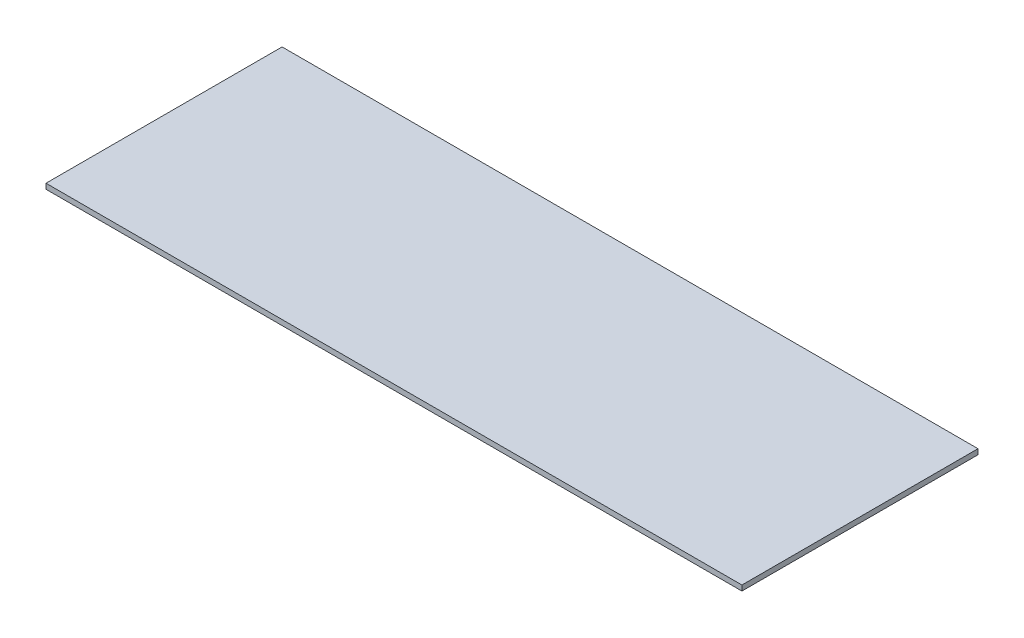
ISO-10303-21;
HEADER;
FILE_DESCRIPTION(('STEP AP214'),'2;1');
FILE_NAME('part.step','',(''),(''),'','','');
FILE_SCHEMA(('AUTOMOTIVE_DESIGN { 1 0 10303 214 1 1 1 1 }'));
ENDSEC;
DATA;
#1=APPLICATION_CONTEXT('core data for automotive mechanical design processes');
#2=APPLICATION_PROTOCOL_DEFINITION('international standard','automotive_design',2000,#1);
#3=PRODUCT_CONTEXT('',#1,'mechanical');
#4=PRODUCT('Part','Part','',(#3));
#5=PRODUCT_RELATED_PRODUCT_CATEGORY('part','',(#4));
#6=PRODUCT_DEFINITION_FORMATION('','',#4);
#7=PRODUCT_DEFINITION_CONTEXT('part definition',#1,'design');
#8=PRODUCT_DEFINITION('design','',#6,#7);
#9=PRODUCT_DEFINITION_SHAPE('','',#8);
#10=(LENGTH_UNIT() NAMED_UNIT(*) SI_UNIT(.MILLI.,.METRE.));
#11=(NAMED_UNIT(*) PLANE_ANGLE_UNIT() SI_UNIT($,.RADIAN.));
#12=(NAMED_UNIT(*) SI_UNIT($,.STERADIAN.) SOLID_ANGLE_UNIT());
#13=UNCERTAINTY_MEASURE_WITH_UNIT(LENGTH_MEASURE(1.E-05),#10,'distance_accuracy_value','');
#14=(GEOMETRIC_REPRESENTATION_CONTEXT(3) GLOBAL_UNCERTAINTY_ASSIGNED_CONTEXT((#13)) GLOBAL_UNIT_ASSIGNED_CONTEXT((#10,
#11,#12)) REPRESENTATION_CONTEXT('',''));
#15=CARTESIAN_POINT('',(0.,0.,0.));
#16=DIRECTION('',(0.,0.,1.));
#17=DIRECTION('',(1.,0.,0.));
#18=AXIS2_PLACEMENT_3D('',#15,#16,#17);
#19=CARTESIAN_POINT('',(-265.052219321149,3.,-19.5221932114882));
#20=DIRECTION('',(1.,0.,0.));
#21=DIRECTION('',(0.,0.,-1.));
#22=AXIS2_PLACEMENT_3D('',#19,#20,#21);
#23=PLANE('',#22);
#24=DIRECTION('',(0.,0.,1.));
#25=VECTOR('',#24,1.);
#26=CARTESIAN_POINT('',(-265.052219321149,0.,-19.5221932114882));
#27=LINE('',#26,#25);
#28=CARTESIAN_POINT('',(-265.052219321149,0.,-19.5221932114882));
#29=VERTEX_POINT('',#28);
#30=CARTESIAN_POINT('',(-265.052219321149,0.,114.477806788512));
#31=VERTEX_POINT('',#30);
#32=EDGE_CURVE('E96',#29,#31,#27,.T.);
#33=ORIENTED_EDGE('',*,*,#32,.T.);
#34=DIRECTION('',(0.,-1.,0.));
#35=VECTOR('',#34,1.);
#36=CARTESIAN_POINT('',(-265.052219321149,3.,114.477806788512));
#37=LINE('',#36,#35);
#38=CARTESIAN_POINT('',(-265.052219321149,3.,114.477806788512));
#39=VERTEX_POINT('',#38);
#40=EDGE_CURVE('E11',#39,#31,#37,.T.);
#41=ORIENTED_EDGE('',*,*,#40,.F.);
#42=DIRECTION('',(0.,0.,1.));
#43=VECTOR('',#42,1.);
#44=CARTESIAN_POINT('',(-265.052219321149,3.,-19.5221932114882));
#45=LINE('',#44,#43);
#46=CARTESIAN_POINT('',(-265.052219321149,3.,-19.5221932114882));
#47=VERTEX_POINT('',#46);
#48=EDGE_CURVE('E84',#47,#39,#45,.T.);
#49=ORIENTED_EDGE('',*,*,#48,.F.);
#50=DIRECTION('',(0.,-1.,0.));
#51=VECTOR('',#50,1.);
#52=CARTESIAN_POINT('',(-265.052219321149,3.,-19.5221932114882));
#53=LINE('',#52,#51);
#54=EDGE_CURVE('E92',#47,#29,#53,.T.);
#55=ORIENTED_EDGE('',*,*,#54,.T.);
#56=EDGE_LOOP('',(#33,#41,#49,#55));
#57=FACE_BOUND('',#56,.T.);
#58=ADVANCED_FACE('F33',(#57),#23,.F.);
#59=CARTESIAN_POINT('',(-265.052219321149,3.,114.477806788512));
#60=DIRECTION('',(0.,0.,-1.));
#61=DIRECTION('',(-1.,0.,0.));
#62=AXIS2_PLACEMENT_3D('',#59,#60,#61);
#63=PLANE('',#62);
#64=DIRECTION('',(1.,0.,0.));
#65=VECTOR('',#64,1.);
#66=CARTESIAN_POINT('',(-265.052219321149,0.,114.477806788512));
#67=LINE('',#66,#65);
#68=CARTESIAN_POINT('',(129.947780678851,0.,114.477806788512));
#69=VERTEX_POINT('',#68);
#70=EDGE_CURVE('E88',#31,#69,#67,.T.);
#71=ORIENTED_EDGE('',*,*,#70,.T.);
#72=DIRECTION('',(0.,-1.,0.));
#73=VECTOR('',#72,1.);
#74=CARTESIAN_POINT('',(129.947780678851,3.,114.477806788512));
#75=LINE('',#74,#73);
#76=CARTESIAN_POINT('',(129.947780678851,3.,114.477806788512));
#77=VERTEX_POINT('',#76);
#78=EDGE_CURVE('E41',#77,#69,#75,.T.);
#79=ORIENTED_EDGE('',*,*,#78,.F.);
#80=DIRECTION('',(1.,0.,0.));
#81=VECTOR('',#80,1.);
#82=CARTESIAN_POINT('',(-265.052219321149,3.,114.477806788512));
#83=LINE('',#82,#81);
#84=EDGE_CURVE('E79',#39,#77,#83,.T.);
#85=ORIENTED_EDGE('',*,*,#84,.F.);
#86=ORIENTED_EDGE('',*,*,#40,.T.);
#87=EDGE_LOOP('',(#71,#79,#85,#86));
#88=FACE_BOUND('',#87,.T.);
#89=ADVANCED_FACE('F87',(#88),#63,.F.);
#90=CARTESIAN_POINT('',(129.947780678851,3.,-19.5221932114882));
#91=DIRECTION('',(-1.,0.,0.));
#92=DIRECTION('',(0.,0.,1.));
#93=AXIS2_PLACEMENT_3D('',#90,#91,#92);
#94=PLANE('',#93);
#95=DIRECTION('',(0.,0.,-1.));
#96=VECTOR('',#95,1.);
#97=CARTESIAN_POINT('',(129.947780678851,0.,-19.5221932114882));
#98=LINE('',#97,#96);
#99=CARTESIAN_POINT('',(129.947780678851,0.,-19.5221932114882));
#100=VERTEX_POINT('',#99);
#101=EDGE_CURVE('E66',#69,#100,#98,.T.);
#102=ORIENTED_EDGE('',*,*,#101,.T.);
#103=DIRECTION('',(0.,-1.,0.));
#104=VECTOR('',#103,1.);
#105=CARTESIAN_POINT('',(129.947780678851,3.,-19.5221932114882));
#106=LINE('',#105,#104);
#107=CARTESIAN_POINT('',(129.947780678851,3.,-19.5221932114882));
#108=VERTEX_POINT('',#107);
#109=EDGE_CURVE('E89',#108,#100,#106,.T.);
#110=ORIENTED_EDGE('',*,*,#109,.F.);
#111=DIRECTION('',(0.,0.,-1.));
#112=VECTOR('',#111,1.);
#113=CARTESIAN_POINT('',(129.947780678851,3.,-19.5221932114882));
#114=LINE('',#113,#112);
#115=EDGE_CURVE('E82',#77,#108,#114,.T.);
#116=ORIENTED_EDGE('',*,*,#115,.F.);
#117=ORIENTED_EDGE('',*,*,#78,.T.);
#118=EDGE_LOOP('',(#102,#110,#116,#117));
#119=FACE_BOUND('',#118,.T.);
#120=ADVANCED_FACE('F90',(#119),#94,.F.);
#121=CARTESIAN_POINT('',(-265.052219321149,3.,-19.5221932114882));
#122=DIRECTION('',(0.,0.,1.));
#123=DIRECTION('',(1.,0.,0.));
#124=AXIS2_PLACEMENT_3D('',#121,#122,#123);
#125=PLANE('',#124);
#126=DIRECTION('',(-1.,0.,0.));
#127=VECTOR('',#126,1.);
#128=CARTESIAN_POINT('',(-265.052219321149,0.,-19.5221932114882));
#129=LINE('',#128,#127);
#130=EDGE_CURVE('E72',#100,#29,#129,.T.);
#131=ORIENTED_EDGE('',*,*,#130,.T.);
#132=ORIENTED_EDGE('',*,*,#54,.F.);
#133=DIRECTION('',(-1.,0.,0.));
#134=VECTOR('',#133,1.);
#135=CARTESIAN_POINT('',(-265.052219321149,3.,-19.5221932114882));
#136=LINE('',#135,#134);
#137=EDGE_CURVE('E49',#108,#47,#136,.T.);
#138=ORIENTED_EDGE('',*,*,#137,.F.);
#139=ORIENTED_EDGE('',*,*,#109,.T.);
#140=EDGE_LOOP('',(#131,#132,#138,#139));
#141=FACE_BOUND('',#140,.T.);
#142=ADVANCED_FACE('F103',(#141),#125,.F.);
#143=CARTESIAN_POINT('',(0.,3.,0.));
#144=DIRECTION('',(0.,1.,0.));
#145=DIRECTION('',(0.,0.,1.));
#146=AXIS2_PLACEMENT_3D('',#143,#144,#145);
#147=PLANE('',#146);
#148=ORIENTED_EDGE('',*,*,#48,.T.);
#149=ORIENTED_EDGE('',*,*,#84,.T.);
#150=ORIENTED_EDGE('',*,*,#115,.T.);
#151=ORIENTED_EDGE('',*,*,#137,.T.);
#152=EDGE_LOOP('',(#148,#149,#150,#151));
#153=FACE_BOUND('',#152,.T.);
#154=ADVANCED_FACE('F80',(#153),#147,.T.);
#155=CARTESIAN_POINT('',(0.,0.,0.));
#156=DIRECTION('',(0.,1.,0.));
#157=DIRECTION('',(0.,0.,1.));
#158=AXIS2_PLACEMENT_3D('',#155,#156,#157);
#159=PLANE('',#158);
#160=ORIENTED_EDGE('',*,*,#32,.F.);
#161=ORIENTED_EDGE('',*,*,#130,.F.);
#162=ORIENTED_EDGE('',*,*,#101,.F.);
#163=ORIENTED_EDGE('',*,*,#70,.F.);
#164=EDGE_LOOP('',(#160,#161,#162,#163));
#165=FACE_BOUND('',#164,.T.);
#166=ADVANCED_FACE('F106',(#165),#159,.F.);
#167=CLOSED_SHELL('',(#58,#89,#120,#142,#154,#166));
#168=MANIFOLD_SOLID_BREP('B2',#167);
#169=ADVANCED_BREP_SHAPE_REPRESENTATION('',(#18,#168),#14);
#170=SHAPE_DEFINITION_REPRESENTATION(#9,#169);
ENDSEC;
END-ISO-10303-21;
